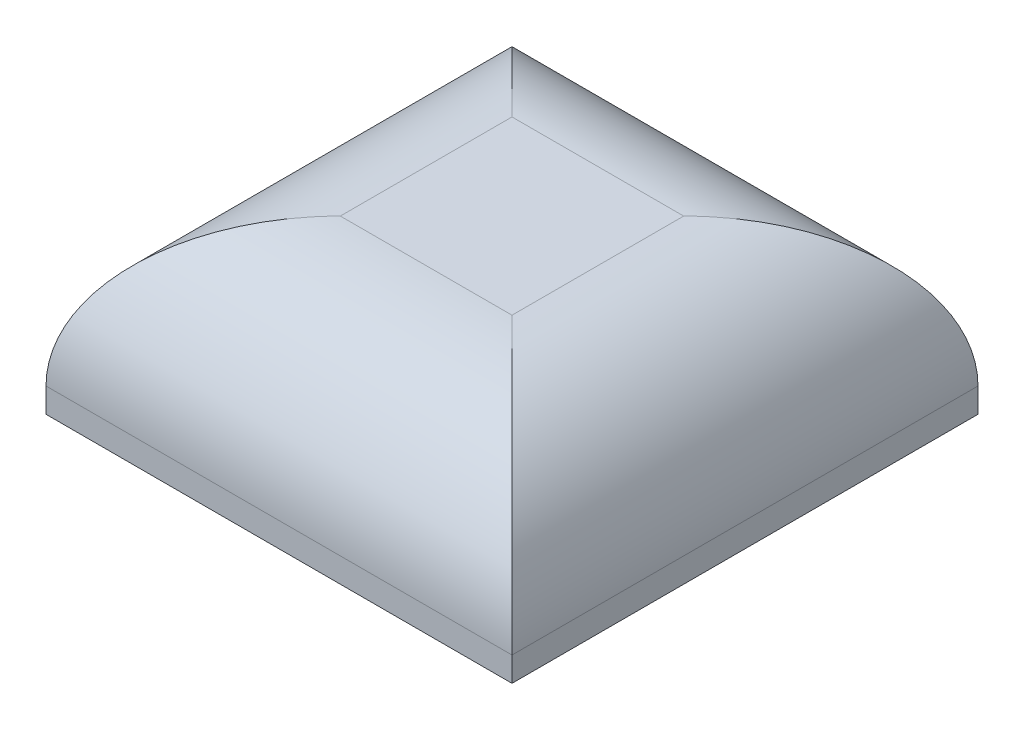
ISO-10303-21;
HEADER;
FILE_DESCRIPTION(('STEP AP214'),'2;1');
FILE_NAME('part.step','',(''),(''),'','','');
FILE_SCHEMA(('AUTOMOTIVE_DESIGN { 1 0 10303 214 1 1 1 1 }'));
ENDSEC;
DATA;
#1=APPLICATION_CONTEXT('core data for automotive mechanical design processes');
#2=APPLICATION_PROTOCOL_DEFINITION('international standard','automotive_design',2000,#1);
#3=PRODUCT_CONTEXT('',#1,'mechanical');
#4=PRODUCT('Part','Part','',(#3));
#5=PRODUCT_RELATED_PRODUCT_CATEGORY('part','',(#4));
#6=PRODUCT_DEFINITION_FORMATION('','',#4);
#7=PRODUCT_DEFINITION_CONTEXT('part definition',#1,'design');
#8=PRODUCT_DEFINITION('design','',#6,#7);
#9=PRODUCT_DEFINITION_SHAPE('','',#8);
#10=(LENGTH_UNIT() NAMED_UNIT(*) SI_UNIT(.MILLI.,.METRE.));
#11=(NAMED_UNIT(*) PLANE_ANGLE_UNIT() SI_UNIT($,.RADIAN.));
#12=(NAMED_UNIT(*) SI_UNIT($,.STERADIAN.) SOLID_ANGLE_UNIT());
#13=UNCERTAINTY_MEASURE_WITH_UNIT(LENGTH_MEASURE(1.E-05),#10,'distance_accuracy_value','');
#14=(GEOMETRIC_REPRESENTATION_CONTEXT(3) GLOBAL_UNCERTAINTY_ASSIGNED_CONTEXT((#13)) GLOBAL_UNIT_ASSIGNED_CONTEXT((#10,
#11,#12)) REPRESENTATION_CONTEXT('',''));
#15=CARTESIAN_POINT('',(0.,0.,0.));
#16=DIRECTION('',(0.,0.,1.));
#17=DIRECTION('',(1.,0.,0.));
#18=AXIS2_PLACEMENT_3D('',#15,#16,#17);
#19=CARTESIAN_POINT('',(0.,0.,0.));
#20=DIRECTION('',(0.,1.,0.));
#21=DIRECTION('',(1.,0.,0.));
#22=AXIS2_PLACEMENT_3D('',#19,#20,#21);
#23=PLANE('',#22);
#24=DIRECTION('',(-1.,0.,0.));
#25=VECTOR('',#24,1.);
#26=CARTESIAN_POINT('',(9.5,0.,-9.5));
#27=LINE('',#26,#25);
#28=CARTESIAN_POINT('',(9.5,0.,-9.5));
#29=VERTEX_POINT('',#28);
#30=CARTESIAN_POINT('',(-9.5,0.,-9.5));
#31=VERTEX_POINT('',#30);
#32=EDGE_CURVE('E36',#29,#31,#27,.T.);
#33=ORIENTED_EDGE('',*,*,#32,.F.);
#34=DIRECTION('',(0.,0.,-1.));
#35=VECTOR('',#34,1.);
#36=CARTESIAN_POINT('',(9.5,0.,9.5));
#37=LINE('',#36,#35);
#38=CARTESIAN_POINT('',(9.5,0.,9.5));
#39=VERTEX_POINT('',#38);
#40=EDGE_CURVE('E95',#39,#29,#37,.T.);
#41=ORIENTED_EDGE('',*,*,#40,.F.);
#42=DIRECTION('',(1.,0.,0.));
#43=VECTOR('',#42,1.);
#44=CARTESIAN_POINT('',(-9.5,0.,9.5));
#45=LINE('',#44,#43);
#46=CARTESIAN_POINT('',(-9.5,0.,9.5));
#47=VERTEX_POINT('',#46);
#48=EDGE_CURVE('E87',#47,#39,#45,.T.);
#49=ORIENTED_EDGE('',*,*,#48,.F.);
#50=DIRECTION('',(0.,0.,1.));
#51=VECTOR('',#50,1.);
#52=CARTESIAN_POINT('',(-9.5,0.,-9.5));
#53=LINE('',#52,#51);
#54=EDGE_CURVE('E11',#31,#47,#53,.T.);
#55=ORIENTED_EDGE('',*,*,#54,.F.);
#56=EDGE_LOOP('',(#33,#41,#49,#55));
#57=FACE_BOUND('',#56,.T.);
#58=ADVANCED_FACE('F17',(#57),#23,.F.);
#59=CARTESIAN_POINT('',(-9.5,0.,-9.5));
#60=DIRECTION('',(-1.,0.,0.));
#61=DIRECTION('',(0.,0.,1.));
#62=AXIS2_PLACEMENT_3D('',#59,#60,#61);
#63=PLANE('',#62);
#64=DIRECTION('',(0.,1.,0.));
#65=VECTOR('',#64,1.);
#66=CARTESIAN_POINT('',(-9.5,0.,-9.5));
#67=LINE('',#66,#65);
#68=CARTESIAN_POINT('',(-9.5,1.,-9.5));
#69=VERTEX_POINT('',#68);
#70=EDGE_CURVE('E113',#31,#69,#67,.T.);
#71=ORIENTED_EDGE('',*,*,#70,.F.);
#72=ORIENTED_EDGE('',*,*,#54,.T.);
#73=DIRECTION('',(0.,1.,0.));
#74=VECTOR('',#73,1.);
#75=CARTESIAN_POINT('',(-9.5,0.,9.5));
#76=LINE('',#75,#74);
#77=CARTESIAN_POINT('',(-9.5,1.,9.5));
#78=VERTEX_POINT('',#77);
#79=EDGE_CURVE('E27',#47,#78,#76,.T.);
#80=ORIENTED_EDGE('',*,*,#79,.T.);
#81=DIRECTION('',(0.,0.,1.));
#82=VECTOR('',#81,1.);
#83=CARTESIAN_POINT('',(-9.5,1.,-9.5));
#84=LINE('',#83,#82);
#85=EDGE_CURVE('E103',#69,#78,#84,.T.);
#86=ORIENTED_EDGE('',*,*,#85,.F.);
#87=EDGE_LOOP('',(#71,#72,#80,#86));
#88=FACE_BOUND('',#87,.T.);
#89=ADVANCED_FACE('F108',(#88),#63,.T.);
#90=CARTESIAN_POINT('',(-3.5,1.,-34.2684));
#91=DIRECTION('',(0.,0.,1.));
#92=DIRECTION('',(0.,1.,0.));
#93=AXIS2_PLACEMENT_3D('',#90,#91,#92);
#94=CYLINDRICAL_SURFACE('',#93,6.);
#95=CARTESIAN_POINT('',(-9.5,1.,9.5));
#96=CARTESIAN_POINT('',(-9.5,1.230751329407,9.5));
#97=CARTESIAN_POINT('',(-9.47336876461,1.683412269889,9.47336876461));
#98=CARTESIAN_POINT('',(-9.36284850695,2.327998520128,9.36284850695));
#99=CARTESIAN_POINT('',(-9.1917421394,2.931199567281,9.1917421394));
#100=CARTESIAN_POINT('',(-8.969491832855,3.490042234114,8.969491832855));
#101=CARTESIAN_POINT('',(-8.704341248922,4.003650778552,8.704341248922));
#102=CARTESIAN_POINT('',(-8.403340421159,4.472328688611,8.403340421159));
#103=CARTESIAN_POINT('',(-8.072172272666,4.897302271018,8.072172272666));
#104=CARTESIAN_POINT('',(-7.71565446914,5.279817346498,7.71565446914));
#105=CARTESIAN_POINT('',(-7.337883670475,5.621134129646,7.337883670475));
#106=CARTESIAN_POINT('',(-6.942437870619,5.922413088176,6.942437870619));
#107=CARTESIAN_POINT('',(-6.532518391669,6.184705743655,6.532518391669));
#108=CARTESIAN_POINT('',(-6.111090175864,6.408952742132,6.111090175864));
#109=CARTESIAN_POINT('',(-5.680970870019,6.596018180815,5.680970870019));
#110=CARTESIAN_POINT('',(-5.245011563734,6.746711961324,5.245011563734));
#111=CARTESIAN_POINT('',(-4.805873332898,6.861933351203,4.805873332898));
#112=CARTESIAN_POINT('',(-4.366470859812,6.942617045461,4.366470859812));
#113=CARTESIAN_POINT('',(-3.929535467824,6.989874629971,3.929535467824));
#114=CARTESIAN_POINT('',(-3.642446712627,7.,3.642446712627));
#115=CARTESIAN_POINT('',(-3.5,7.,3.5));
#116=B_SPLINE_CURVE_WITH_KNOTS('',3,(#95,#96,#97,#98,#99,#100,#101,#102,#103,#104,#105,#106,
#107,#108,#109,#110,#111,#112,#113,#114,#115),.UNSPECIFIED.,.F.,.F.,(4,1,1,1,1,1,1,1,1,1,1,1,1,
1,1,1,1,1,4),(0.,0.05555555555556,0.1111111111111,0.1666666666667,0.2222222222222,
0.2777777777778,0.3333333333333,0.3888888888889,0.4444444444444,0.5,0.5555555555556,
0.6111111111111,0.6666666666667,0.7222222222222,0.7777777777778,0.8333333333333,0.8888888888889,
0.9444444444444,1.),.UNSPECIFIED.);
#117=CARTESIAN_POINT('',(-3.5,7.,3.5));
#118=VERTEX_POINT('',#117);
#119=EDGE_CURVE('E99',#78,#118,#116,.T.);
#120=ORIENTED_EDGE('',*,*,#119,.T.);
#121=DIRECTION('',(0.,0.,1.));
#122=VECTOR('',#121,1.);
#123=CARTESIAN_POINT('',(-3.5,7.,-3.5));
#124=LINE('',#123,#122);
#125=CARTESIAN_POINT('',(-3.5,7.,-3.5));
#126=VERTEX_POINT('',#125);
#127=EDGE_CURVE('E118',#126,#118,#124,.T.);
#128=ORIENTED_EDGE('',*,*,#127,.F.);
#129=CARTESIAN_POINT('',(-9.5,1.,-9.5));
#130=CARTESIAN_POINT('',(-9.5,1.230751329407,-9.5));
#131=CARTESIAN_POINT('',(-9.47336876461,1.683412269889,-9.47336876461));
#132=CARTESIAN_POINT('',(-9.36284850695,2.327998520128,-9.36284850695));
#133=CARTESIAN_POINT('',(-9.1917421394,2.931199567281,-9.1917421394));
#134=CARTESIAN_POINT('',(-8.969491832855,3.490042234114,-8.969491832855));
#135=CARTESIAN_POINT('',(-8.704341248922,4.003650778552,-8.704341248922));
#136=CARTESIAN_POINT('',(-8.403340421159,4.472328688611,-8.403340421159));
#137=CARTESIAN_POINT('',(-8.072172272666,4.897302271018,-8.072172272666));
#138=CARTESIAN_POINT('',(-7.71565446914,5.279817346498,-7.71565446914));
#139=CARTESIAN_POINT('',(-7.337883670475,5.621134129646,-7.337883670475));
#140=CARTESIAN_POINT('',(-6.942437870619,5.922413088176,-6.942437870619));
#141=CARTESIAN_POINT('',(-6.532518391669,6.184705743655,-6.532518391669));
#142=CARTESIAN_POINT('',(-6.111090175864,6.408952742132,-6.111090175864));
#143=CARTESIAN_POINT('',(-5.680970870019,6.596018180815,-5.680970870019));
#144=CARTESIAN_POINT('',(-5.245011563734,6.746711961324,-5.245011563734));
#145=CARTESIAN_POINT('',(-4.805873332898,6.861933351203,-4.805873332898));
#146=CARTESIAN_POINT('',(-4.366470859812,6.942617045461,-4.366470859812));
#147=CARTESIAN_POINT('',(-3.929535467824,6.989874629971,-3.929535467824));
#148=CARTESIAN_POINT('',(-3.642446712627,7.,-3.642446712627));
#149=CARTESIAN_POINT('',(-3.5,7.,-3.5));
#150=B_SPLINE_CURVE_WITH_KNOTS('',3,(#129,#130,#131,#132,#133,#134,#135,#136,#137,#138,#139,
#140,#141,#142,#143,#144,#145,#146,#147,#148,#149),.UNSPECIFIED.,.F.,.F.,(4,1,1,1,1,1,1,1,1,1,1,
1,1,1,1,1,1,1,4),(0.,0.05555555555556,0.1111111111111,0.1666666666667,0.2222222222222,
0.2777777777778,0.3333333333333,0.3888888888889,0.4444444444444,0.5,0.5555555555556,
0.6111111111111,0.6666666666667,0.7222222222222,0.7777777777778,0.8333333333333,0.8888888888889,
0.9444444444444,1.),.UNSPECIFIED.);
#151=EDGE_CURVE('E124',#69,#126,#150,.T.);
#152=ORIENTED_EDGE('',*,*,#151,.F.);
#153=ORIENTED_EDGE('',*,*,#85,.T.);
#154=EDGE_LOOP('',(#120,#128,#152,#153));
#155=FACE_BOUND('',#154,.T.);
#156=ADVANCED_FACE('F154',(#155),#94,.T.);
#157=CARTESIAN_POINT('',(34.2684,1.,-3.5));
#158=DIRECTION('',(-1.,0.,0.));
#159=DIRECTION('',(0.,1.,0.));
#160=AXIS2_PLACEMENT_3D('',#157,#158,#159);
#161=CYLINDRICAL_SURFACE('',#160,6.);
#162=CARTESIAN_POINT('',(9.5,1.,-9.5));
#163=CARTESIAN_POINT('',(9.5,1.230751329407,-9.5));
#164=CARTESIAN_POINT('',(9.47336876461,1.683412269889,-9.47336876461));
#165=CARTESIAN_POINT('',(9.36284850695,2.327998520128,-9.36284850695));
#166=CARTESIAN_POINT('',(9.1917421394,2.931199567281,-9.1917421394));
#167=CARTESIAN_POINT('',(8.969491832855,3.490042234114,-8.969491832855));
#168=CARTESIAN_POINT('',(8.704341248922,4.003650778552,-8.704341248922));
#169=CARTESIAN_POINT('',(8.403340421159,4.472328688611,-8.403340421159));
#170=CARTESIAN_POINT('',(8.072172272666,4.897302271018,-8.072172272666));
#171=CARTESIAN_POINT('',(7.71565446914,5.279817346498,-7.71565446914));
#172=CARTESIAN_POINT('',(7.337883670475,5.621134129646,-7.337883670475));
#173=CARTESIAN_POINT('',(6.942437870619,5.922413088176,-6.942437870619));
#174=CARTESIAN_POINT('',(6.532518391669,6.184705743655,-6.532518391669));
#175=CARTESIAN_POINT('',(6.111090175864,6.408952742132,-6.111090175864));
#176=CARTESIAN_POINT('',(5.680970870019,6.596018180815,-5.680970870019));
#177=CARTESIAN_POINT('',(5.245011563734,6.746711961324,-5.245011563734));
#178=CARTESIAN_POINT('',(4.805873332898,6.861933351203,-4.805873332898));
#179=CARTESIAN_POINT('',(4.366470859812,6.942617045461,-4.366470859812));
#180=CARTESIAN_POINT('',(3.929535467824,6.989874629971,-3.929535467824));
#181=CARTESIAN_POINT('',(3.642446712627,7.,-3.642446712627));
#182=CARTESIAN_POINT('',(3.5,7.,-3.5));
#183=B_SPLINE_CURVE_WITH_KNOTS('',3,(#162,#163,#164,#165,#166,#167,#168,#169,#170,#171,#172,
#173,#174,#175,#176,#177,#178,#179,#180,#181,#182),.UNSPECIFIED.,.F.,.F.,(4,1,1,1,1,1,1,1,1,1,1,
1,1,1,1,1,1,1,4),(0.,0.05555555555556,0.1111111111111,0.1666666666667,0.2222222222222,
0.2777777777778,0.3333333333333,0.3888888888889,0.4444444444444,0.5,0.5555555555556,
0.6111111111111,0.6666666666667,0.7222222222222,0.7777777777778,0.8333333333333,0.8888888888889,
0.9444444444444,1.),.UNSPECIFIED.);
#184=CARTESIAN_POINT('',(9.5,1.,-9.5));
#185=VERTEX_POINT('',#184);
#186=CARTESIAN_POINT('',(3.5,7.,-3.5));
#187=VERTEX_POINT('',#186);
#188=EDGE_CURVE('E94',#185,#187,#183,.T.);
#189=ORIENTED_EDGE('',*,*,#188,.F.);
#190=DIRECTION('',(-1.,0.,0.));
#191=VECTOR('',#190,1.);
#192=CARTESIAN_POINT('',(9.5,1.,-9.5));
#193=LINE('',#192,#191);
#194=EDGE_CURVE('E114',#185,#69,#193,.T.);
#195=ORIENTED_EDGE('',*,*,#194,.T.);
#196=ORIENTED_EDGE('',*,*,#151,.T.);
#197=DIRECTION('',(-1.,0.,0.));
#198=VECTOR('',#197,1.);
#199=CARTESIAN_POINT('',(3.5,7.,-3.5));
#200=LINE('',#199,#198);
#201=EDGE_CURVE('E123',#187,#126,#200,.T.);
#202=ORIENTED_EDGE('',*,*,#201,.F.);
#203=EDGE_LOOP('',(#189,#195,#196,#202));
#204=FACE_BOUND('',#203,.T.);
#205=ADVANCED_FACE('F157',(#204),#161,.T.);
#206=CARTESIAN_POINT('',(0.,7.,0.));
#207=DIRECTION('',(0.,1.,0.));
#208=DIRECTION('',(1.,0.,0.));
#209=AXIS2_PLACEMENT_3D('',#206,#207,#208);
#210=PLANE('',#209);
#211=ORIENTED_EDGE('',*,*,#201,.T.);
#212=ORIENTED_EDGE('',*,*,#127,.T.);
#213=DIRECTION('',(1.,0.,0.));
#214=VECTOR('',#213,1.);
#215=CARTESIAN_POINT('',(-3.5,7.,3.5));
#216=LINE('',#215,#214);
#217=CARTESIAN_POINT('',(3.5,7.,3.5));
#218=VERTEX_POINT('',#217);
#219=EDGE_CURVE('E101',#118,#218,#216,.T.);
#220=ORIENTED_EDGE('',*,*,#219,.T.);
#221=DIRECTION('',(0.,0.,-1.));
#222=VECTOR('',#221,1.);
#223=CARTESIAN_POINT('',(3.5,7.,3.5));
#224=LINE('',#223,#222);
#225=EDGE_CURVE('E68',#218,#187,#224,.T.);
#226=ORIENTED_EDGE('',*,*,#225,.T.);
#227=EDGE_LOOP('',(#211,#212,#220,#226));
#228=FACE_BOUND('',#227,.T.);
#229=ADVANCED_FACE('F159',(#228),#210,.T.);
#230=CARTESIAN_POINT('',(3.5,1.,34.2684));
#231=DIRECTION('',(0.,0.,-1.));
#232=DIRECTION('',(0.,1.,0.));
#233=AXIS2_PLACEMENT_3D('',#230,#231,#232);
#234=CYLINDRICAL_SURFACE('',#233,6.);
#235=ORIENTED_EDGE('',*,*,#188,.T.);
#236=ORIENTED_EDGE('',*,*,#225,.F.);
#237=CARTESIAN_POINT('',(9.5,1.,9.5));
#238=CARTESIAN_POINT('',(9.5,1.230751329407,9.5));
#239=CARTESIAN_POINT('',(9.47336876461,1.683412269889,9.47336876461));
#240=CARTESIAN_POINT('',(9.36284850695,2.327998520128,9.36284850695));
#241=CARTESIAN_POINT('',(9.1917421394,2.931199567281,9.1917421394));
#242=CARTESIAN_POINT('',(8.969491832855,3.490042234114,8.969491832855));
#243=CARTESIAN_POINT('',(8.704341248922,4.003650778552,8.704341248922));
#244=CARTESIAN_POINT('',(8.403340421159,4.472328688611,8.403340421159));
#245=CARTESIAN_POINT('',(8.072172272666,4.897302271018,8.072172272666));
#246=CARTESIAN_POINT('',(7.71565446914,5.279817346498,7.71565446914));
#247=CARTESIAN_POINT('',(7.337883670475,5.621134129646,7.337883670475));
#248=CARTESIAN_POINT('',(6.942437870619,5.922413088176,6.942437870619));
#249=CARTESIAN_POINT('',(6.532518391669,6.184705743655,6.532518391669));
#250=CARTESIAN_POINT('',(6.111090175864,6.408952742132,6.111090175864));
#251=CARTESIAN_POINT('',(5.680970870019,6.596018180815,5.680970870019));
#252=CARTESIAN_POINT('',(5.245011563734,6.746711961324,5.245011563734));
#253=CARTESIAN_POINT('',(4.805873332898,6.861933351203,4.805873332898));
#254=CARTESIAN_POINT('',(4.366470859812,6.942617045461,4.366470859812));
#255=CARTESIAN_POINT('',(3.929535467824,6.989874629971,3.929535467824));
#256=CARTESIAN_POINT('',(3.642446712627,7.,3.642446712627));
#257=CARTESIAN_POINT('',(3.5,7.,3.5));
#258=B_SPLINE_CURVE_WITH_KNOTS('',3,(#237,#238,#239,#240,#241,#242,#243,#244,#245,#246,#247,
#248,#249,#250,#251,#252,#253,#254,#255,#256,#257),.UNSPECIFIED.,.F.,.F.,(4,1,1,1,1,1,1,1,1,1,1,
1,1,1,1,1,1,1,4),(0.,0.05555555555556,0.1111111111111,0.1666666666667,0.2222222222222,
0.2777777777778,0.3333333333333,0.3888888888889,0.4444444444444,0.5,0.5555555555556,
0.6111111111111,0.6666666666667,0.7222222222222,0.7777777777778,0.8333333333333,0.8888888888889,
0.9444444444444,1.),.UNSPECIFIED.);
#259=CARTESIAN_POINT('',(9.5,1.,9.5));
#260=VERTEX_POINT('',#259);
#261=EDGE_CURVE('E71',#260,#218,#258,.T.);
#262=ORIENTED_EDGE('',*,*,#261,.F.);
#263=DIRECTION('',(0.,0.,-1.));
#264=VECTOR('',#263,1.);
#265=CARTESIAN_POINT('',(9.5,1.,9.5));
#266=LINE('',#265,#264);
#267=EDGE_CURVE('E75',#260,#185,#266,.T.);
#268=ORIENTED_EDGE('',*,*,#267,.T.);
#269=EDGE_LOOP('',(#235,#236,#262,#268));
#270=FACE_BOUND('',#269,.T.);
#271=ADVANCED_FACE('F73',(#270),#234,.T.);
#272=CARTESIAN_POINT('',(9.5,0.,9.5));
#273=DIRECTION('',(1.,0.,0.));
#274=DIRECTION('',(0.,0.,-1.));
#275=AXIS2_PLACEMENT_3D('',#272,#273,#274);
#276=PLANE('',#275);
#277=DIRECTION('',(0.,1.,0.));
#278=VECTOR('',#277,1.);
#279=CARTESIAN_POINT('',(9.5,0.,9.5));
#280=LINE('',#279,#278);
#281=EDGE_CURVE('E80',#39,#260,#280,.T.);
#282=ORIENTED_EDGE('',*,*,#281,.F.);
#283=ORIENTED_EDGE('',*,*,#40,.T.);
#284=DIRECTION('',(0.,1.,0.));
#285=VECTOR('',#284,1.);
#286=CARTESIAN_POINT('',(9.5,0.,-9.5));
#287=LINE('',#286,#285);
#288=EDGE_CURVE('E93',#29,#185,#287,.T.);
#289=ORIENTED_EDGE('',*,*,#288,.T.);
#290=ORIENTED_EDGE('',*,*,#267,.F.);
#291=EDGE_LOOP('',(#282,#283,#289,#290));
#292=FACE_BOUND('',#291,.T.);
#293=ADVANCED_FACE('F91',(#292),#276,.T.);
#294=CARTESIAN_POINT('',(9.5,0.,-9.5));
#295=DIRECTION('',(0.,0.,-1.));
#296=DIRECTION('',(-1.,0.,0.));
#297=AXIS2_PLACEMENT_3D('',#294,#295,#296);
#298=PLANE('',#297);
#299=ORIENTED_EDGE('',*,*,#288,.F.);
#300=ORIENTED_EDGE('',*,*,#32,.T.);
#301=ORIENTED_EDGE('',*,*,#70,.T.);
#302=ORIENTED_EDGE('',*,*,#194,.F.);
#303=EDGE_LOOP('',(#299,#300,#301,#302));
#304=FACE_BOUND('',#303,.T.);
#305=ADVANCED_FACE('F153',(#304),#298,.T.);
#306=CARTESIAN_POINT('',(-9.5,0.,9.5));
#307=DIRECTION('',(0.,0.,1.));
#308=DIRECTION('',(1.,0.,0.));
#309=AXIS2_PLACEMENT_3D('',#306,#307,#308);
#310=PLANE('',#309);
#311=ORIENTED_EDGE('',*,*,#79,.F.);
#312=ORIENTED_EDGE('',*,*,#48,.T.);
#313=ORIENTED_EDGE('',*,*,#281,.T.);
#314=DIRECTION('',(1.,0.,0.));
#315=VECTOR('',#314,1.);
#316=CARTESIAN_POINT('',(-9.5,1.,9.5));
#317=LINE('',#316,#315);
#318=EDGE_CURVE('E21',#78,#260,#317,.T.);
#319=ORIENTED_EDGE('',*,*,#318,.F.);
#320=EDGE_LOOP('',(#311,#312,#313,#319));
#321=FACE_BOUND('',#320,.T.);
#322=ADVANCED_FACE('F86',(#321),#310,.T.);
#323=CARTESIAN_POINT('',(-34.2684,1.,3.5));
#324=DIRECTION('',(1.,0.,0.));
#325=DIRECTION('',(0.,1.,0.));
#326=AXIS2_PLACEMENT_3D('',#323,#324,#325);
#327=CYLINDRICAL_SURFACE('',#326,6.);
#328=ORIENTED_EDGE('',*,*,#261,.T.);
#329=ORIENTED_EDGE('',*,*,#219,.F.);
#330=ORIENTED_EDGE('',*,*,#119,.F.);
#331=ORIENTED_EDGE('',*,*,#318,.T.);
#332=EDGE_LOOP('',(#328,#329,#330,#331));
#333=FACE_BOUND('',#332,.T.);
#334=ADVANCED_FACE('F19',(#333),#327,.T.);
#335=CLOSED_SHELL('',(#58,#89,#156,#205,#229,#271,#293,#305,#322,#334));
#336=MANIFOLD_SOLID_BREP('B1',#335);
#337=ADVANCED_BREP_SHAPE_REPRESENTATION('',(#18,#336),#14);
#338=SHAPE_DEFINITION_REPRESENTATION(#9,#337);
ENDSEC;
END-ISO-10303-21;
